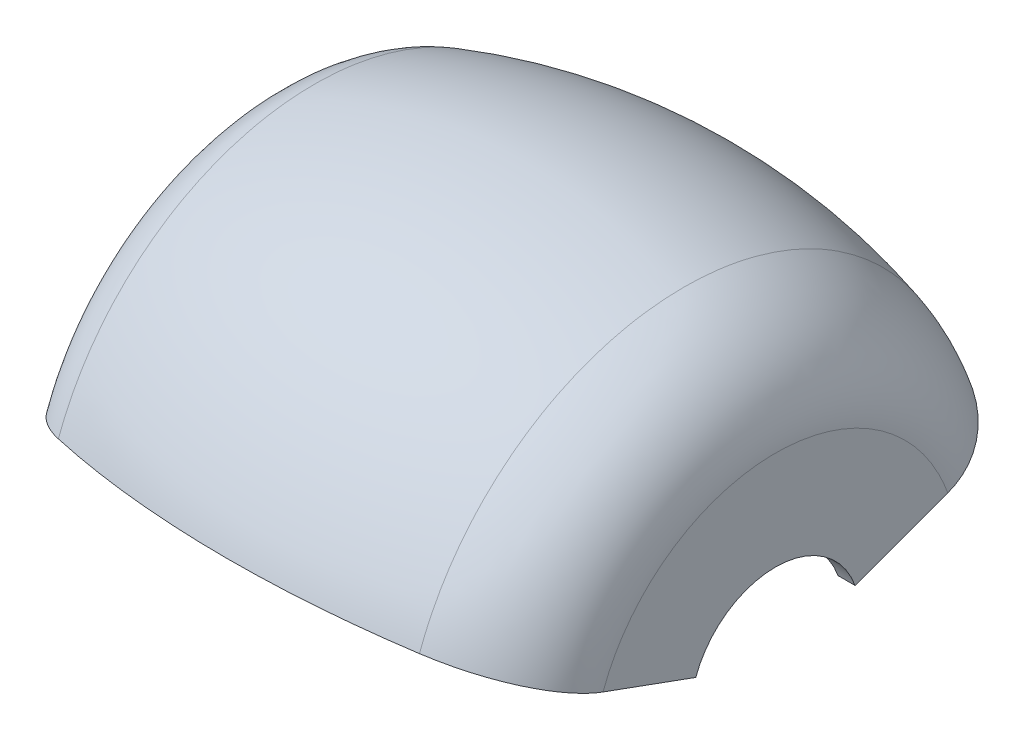
ISO-10303-21;
HEADER;
FILE_DESCRIPTION(('STEP AP214'),'2;1');
FILE_NAME('part.step','',(''),(''),'','','');
FILE_SCHEMA(('AUTOMOTIVE_DESIGN { 1 0 10303 214 1 1 1 1 }'));
ENDSEC;
DATA;
#1=APPLICATION_CONTEXT('core data for automotive mechanical design processes');
#2=APPLICATION_PROTOCOL_DEFINITION('international standard','automotive_design',2000,#1);
#3=PRODUCT_CONTEXT('',#1,'mechanical');
#4=PRODUCT('Part','Part','',(#3));
#5=PRODUCT_RELATED_PRODUCT_CATEGORY('part','',(#4));
#6=PRODUCT_DEFINITION_FORMATION('','',#4);
#7=PRODUCT_DEFINITION_CONTEXT('part definition',#1,'design');
#8=PRODUCT_DEFINITION('design','',#6,#7);
#9=PRODUCT_DEFINITION_SHAPE('','',#8);
#10=(LENGTH_UNIT() NAMED_UNIT(*) SI_UNIT(.MILLI.,.METRE.));
#11=(NAMED_UNIT(*) PLANE_ANGLE_UNIT() SI_UNIT($,.RADIAN.));
#12=(NAMED_UNIT(*) SI_UNIT($,.STERADIAN.) SOLID_ANGLE_UNIT());
#13=UNCERTAINTY_MEASURE_WITH_UNIT(LENGTH_MEASURE(1.E-05),#10,'distance_accuracy_value','');
#14=(GEOMETRIC_REPRESENTATION_CONTEXT(3) GLOBAL_UNCERTAINTY_ASSIGNED_CONTEXT((#13)) GLOBAL_UNIT_ASSIGNED_CONTEXT((#10,
#11,#12)) REPRESENTATION_CONTEXT('',''));
#15=CARTESIAN_POINT('',(0.,0.,0.));
#16=DIRECTION('',(0.,0.,1.));
#17=DIRECTION('',(1.,0.,0.));
#18=AXIS2_PLACEMENT_3D('',#15,#16,#17);
#19=CARTESIAN_POINT('',(0.232167243709482,0.,0.));
#20=DIRECTION('',(-1.,0.,0.));
#21=DIRECTION('',(0.,0.,1.));
#22=AXIS2_PLACEMENT_3D('',#19,#20,#21);
#23=DEGENERATE_TOROIDAL_SURFACE('',#22,49.611301747532,95.25,.F.);
#24=CARTESIAN_POINT('',(0.232167243709482,-16.9680645342638,46.6193741597389));
#25=DIRECTION('',(0.,0.93969262078591,0.342020143325666));
#26=DIRECTION('',(-1.,0.,0.));
#27=AXIS2_PLACEMENT_3D('',#24,#25,#26);
#28=CIRCLE('',#27,95.25);
#29=CARTESIAN_POINT('',(25.6830243821265,14.4246691292249,-39.63145271565));
#30=VERTEX_POINT('',#29);
#31=CARTESIAN_POINT('',(-29.6959608343053,13.9592704620694,-38.352780710956));
#32=VERTEX_POINT('',#31);
#33=EDGE_CURVE('E164',#30,#32,#28,.T.);
#34=ORIENTED_EDGE('',*,*,#33,.T.);
#35=CARTESIAN_POINT('',(-29.6957917777997,9.1813321579418,39.7687187359148));
#36=CARTESIAN_POINT('',(-29.6957917778131,13.6355401925726,38.7403837840581));
#37=CARTESIAN_POINT('',(-29.6957917777986,17.913607264452,36.9573256661375));
#38=CARTESIAN_POINT('',(-29.6957917778007,25.6451315839683,32.0790971141469));
#39=CARTESIAN_POINT('',(-29.695791777799,29.0965244800541,28.9850566464784));
#40=CARTESIAN_POINT('',(-29.6957917778004,34.7874653819627,21.8305633898133));
#41=CARTESIAN_POINT('',(-29.6957917777984,37.0258113219643,17.7716218046718));
#42=CARTESIAN_POINT('',(-29.6957917778009,40.0397966448433,9.14089329647315));
#43=CARTESIAN_POINT('',(-29.6957917777997,40.8147994003494,4.57092939424832));
#44=CARTESIAN_POINT('',(-29.6957917777997,40.8147994003494,-4.57092939424831));
#45=CARTESIAN_POINT('',(-29.6957917778009,40.0397966448433,-9.1408932964731));
#46=CARTESIAN_POINT('',(-29.6957917777984,37.0258113219643,-17.7716218046717));
#47=CARTESIAN_POINT('',(-29.6957917778008,34.787465381962,-21.8305633898139));
#48=CARTESIAN_POINT('',(-29.6957917777985,29.0965244800548,-28.9850566464778));
#49=CARTESIAN_POINT('',(-29.6957917778002,25.6451315839702,-32.0790971141458));
#50=CARTESIAN_POINT('',(-29.6957917777991,17.91360726445,-36.9573256661385));
#51=CARTESIAN_POINT('',(-29.6957917778018,13.635540192575,-38.7403837840614));
#52=CARTESIAN_POINT('',(-29.6957917777997,9.18133215794181,-39.7687187359148));
#53=(BOUNDED_CURVE() B_SPLINE_CURVE(3,(#35,#36,#37,#38,#39,#40,#41,#42,#43,#44,#45,#46,#47,#48,
#49,#50,#51,#52),.UNSPECIFIED.,.F.,.F.) B_SPLINE_CURVE_WITH_KNOTS((4,2,2,2,2,2,2,2,4),
(0.22689280275926,0.562868683768169,0.898844564777078,1.23482044578599,1.5707963267949,
1.90677220780381,2.24274808881272,2.57872396982162,2.91469985083053),
.UNSPECIFIED.) CURVE() GEOMETRIC_REPRESENTATION_ITEM() RATIONAL_B_SPLINE_CURVE((1.,1.,1.,1.,1.,
1.,1.,1.,1.,1.,1.,1.,1.,1.,1.,1.,1.,1.)) REPRESENTATION_ITEM(''));
#54=CARTESIAN_POINT('',(-29.6959608343167,13.959270566308,38.352780672989));
#55=VERTEX_POINT('',#54);
#56=EDGE_CURVE('E68',#32,#55,#53,.F.);
#57=ORIENTED_EDGE('',*,*,#56,.T.);
#58=CARTESIAN_POINT('',(0.232167243709482,-16.9680645342638,-46.6193741597389));
#59=DIRECTION('',(0.,-0.93969262078591,0.342020143325666));
#60=DIRECTION('',(-1.,0.,0.));
#61=AXIS2_PLACEMENT_3D('',#58,#59,#60);
#62=CIRCLE('',#61,95.25);
#63=CARTESIAN_POINT('',(25.6830243821252,14.4246690215097,39.631452754879));
#64=VERTEX_POINT('',#63);
#65=EDGE_CURVE('E214',#64,#55,#62,.T.);
#66=ORIENTED_EDGE('',*,*,#65,.F.);
#67=CARTESIAN_POINT('',(25.6828735879625,9.4874318579387,-41.094582201577));
#68=CARTESIAN_POINT('',(25.682873587968,14.0901403195042,-40.0319632247755));
#69=CARTESIAN_POINT('',(25.6828735879647,18.5108353913234,-38.1894590979904));
#70=CARTESIAN_POINT('',(25.6828735879603,26.500123751971,-33.1485935480237));
#71=CARTESIAN_POINT('',(25.6828735879591,30.0665838635013,-29.9513997646341));
#72=CARTESIAN_POINT('',(25.6828735879659,35.9472570696863,-22.5583803108204));
#73=CARTESIAN_POINT('',(25.6828735879666,38.2602280211729,-18.3641162283841));
#74=CARTESIAN_POINT('',(25.6828735879585,41.3746976734889,-9.4456447905546));
#75=CARTESIAN_POINT('',(25.6828735879625,42.1755385215316,-4.72332123622386));
#76=CARTESIAN_POINT('',(25.6828735879625,42.1755385215316,4.72332123622386));
#77=CARTESIAN_POINT('',(25.6828735879632,41.3746976734837,9.44564479056555));
#78=CARTESIAN_POINT('',(25.6828735879618,38.2602280211782,18.3641162283731));
#79=CARTESIAN_POINT('',(25.6828735879633,35.9472570696824,22.5583803108265));
#80=CARTESIAN_POINT('',(25.6828735879617,30.0665838635052,29.951399764628));
#81=CARTESIAN_POINT('',(25.6828735879635,26.5001237519635,33.1485935480274));
#82=CARTESIAN_POINT('',(25.6828735879615,18.510835391331,38.1894590979866));
#83=CARTESIAN_POINT('',(25.6828735879665,14.0901403194983,40.0319632247773));
#84=CARTESIAN_POINT('',(25.6828735879625,9.4874318579387,41.094582201577));
#85=(BOUNDED_CURVE() B_SPLINE_CURVE(3,(#67,#68,#69,#70,#71,#72,#73,#74,#75,#76,#77,#78,#79,#80,
#81,#82,#83,#84),.UNSPECIFIED.,.F.,.F.) B_SPLINE_CURVE_WITH_KNOTS((4,2,2,2,2,2,2,2,4),
(0.226892802759259,0.562868683768169,0.898844564777078,1.23482044578599,1.5707963267949,
1.90677220780381,2.24274808881272,2.57872396982162,2.91469985083053),
.UNSPECIFIED.) CURVE() GEOMETRIC_REPRESENTATION_ITEM() RATIONAL_B_SPLINE_CURVE((1.,1.,1.,1.,1.,
1.,1.,1.,1.,1.,1.,1.,1.,1.,1.,1.,1.,1.)) REPRESENTATION_ITEM(''));
#86=EDGE_CURVE('E251',#64,#30,#85,.F.);
#87=ORIENTED_EDGE('',*,*,#86,.T.);
#88=EDGE_LOOP('',(#34,#57,#66,#87));
#89=FACE_BOUND('',#88,.T.);
#90=ADVANCED_FACE('F40',(#89),#23,.F.);
#91=CARTESIAN_POINT('',(39.390760572882,4.34365582023596,11.9340962839811));
#92=DIRECTION('',(-1.,0.,0.));
#93=DIRECTION('',(0.,0.,1.));
#94=AXIS2_PLACEMENT_3D('',#91,#92,#93);
#95=PLANE('',#94);
#96=DIRECTION('',(0.,0.342020143325666,-0.93969262078591));
#97=VECTOR('',#96,1.);
#98=CARTESIAN_POINT('',(39.390760572882,4.34365582023596,-11.9340962839811));
#99=LINE('',#98,#97);
#100=CARTESIAN_POINT('',(39.390760572882,4.34365582023596,-11.9340962839811));
#101=VERTEX_POINT('',#100);
#102=CARTESIAN_POINT('',(39.390760572882,9.40175090013267,-25.8310983014519));
#103=VERTEX_POINT('',#102);
#104=EDGE_CURVE('E206',#101,#103,#99,.T.);
#105=ORIENTED_EDGE('',*,*,#104,.T.);
#106=CARTESIAN_POINT('',(39.390760572882,6.1838244189919,26.7850862816731));
#107=CARTESIAN_POINT('',(39.390760572882,9.18382920471687,26.0924806034017));
#108=CARTESIAN_POINT('',(39.390760572882,12.0651992681317,24.8915526619215));
#109=CARTESIAN_POINT('',(39.390760572882,17.2725469671309,21.6059609499019));
#110=CARTESIAN_POINT('',(39.390760572882,19.5971342165937,19.5220582367116));
#111=CARTESIAN_POINT('',(39.390760572882,23.4301051529847,14.7033533529152));
#112=CARTESIAN_POINT('',(39.390760572882,24.9376792219723,11.9695690115774));
#113=CARTESIAN_POINT('',(39.390760572882,26.9676630760274,6.15658797698049));
#114=CARTESIAN_POINT('',(39.390760572882,27.4896440784815,3.07861912861739));
#115=CARTESIAN_POINT('',(39.390760572882,27.4896440784815,-3.07861912861739));
#116=CARTESIAN_POINT('',(39.390760572882,26.9676630760381,-6.15658797697784));
#117=CARTESIAN_POINT('',(39.390760572882,24.9376792219616,-11.96956901158));
#118=CARTESIAN_POINT('',(39.390760572882,23.4301051529857,-14.7033533529112));
#119=CARTESIAN_POINT('',(39.390760572882,19.5971342165927,-19.5220582367157));
#120=CARTESIAN_POINT('',(39.390760572882,17.2725469671387,-21.6059609499079));
#121=CARTESIAN_POINT('',(39.390760572882,12.0651992681238,-24.8915526619155));
#122=CARTESIAN_POINT('',(39.390760572882,9.18382920472543,-26.0924806034177));
#123=CARTESIAN_POINT('',(39.390760572882,6.1838244189919,-26.7850862816731));
#124=(BOUNDED_CURVE() B_SPLINE_CURVE(3,(#106,#107,#108,#109,#110,#111,#112,#113,#114,#115,#116,
#117,#118,#119,#120,#121,#122,#123),.UNSPECIFIED.,.F.,.F.) B_SPLINE_CURVE_WITH_KNOTS((4,2,2,2,2,
2,2,2,4),(0.22689280275926,0.562868683768169,0.898844564777078,1.23482044578599,1.5707963267949,
1.90677220780381,2.24274808881272,2.57872396982162,2.91469985083053),
.UNSPECIFIED.) CURVE() GEOMETRIC_REPRESENTATION_ITEM() RATIONAL_B_SPLINE_CURVE((1.,1.,1.,1.,1.,
1.,1.,1.,1.,1.,1.,1.,1.,1.,1.,1.,1.,1.)) REPRESENTATION_ITEM(''));
#125=CARTESIAN_POINT('',(39.390760572882,9.40175090013067,25.8310983014464));
#126=VERTEX_POINT('',#125);
#127=EDGE_CURVE('E12',#103,#126,#124,.F.);
#128=ORIENTED_EDGE('',*,*,#127,.T.);
#129=DIRECTION('',(0.,0.342020143325666,0.93969262078591));
#130=VECTOR('',#129,1.);
#131=CARTESIAN_POINT('',(39.390760572882,4.34365582023596,11.9340962839811));
#132=LINE('',#131,#130);
#133=CARTESIAN_POINT('',(39.390760572882,4.34365582023596,11.9340962839811));
#134=VERTEX_POINT('',#133);
#135=EDGE_CURVE('E173',#134,#126,#132,.T.);
#136=ORIENTED_EDGE('',*,*,#135,.F.);
#137=CARTESIAN_POINT('',(39.390760572882,0.,0.));
#138=DIRECTION('',(-1.,0.,0.));
#139=DIRECTION('',(0.,0.,1.));
#140=AXIS2_PLACEMENT_3D('',#137,#138,#139);
#141=CIRCLE('',#140,12.7);
#142=EDGE_CURVE('E298',#134,#101,#141,.T.);
#143=ORIENTED_EDGE('',*,*,#142,.T.);
#144=EDGE_LOOP('',(#105,#128,#136,#143));
#145=FACE_BOUND('',#144,.T.);
#146=ADVANCED_FACE('F263',(#145),#95,.F.);
#147=CARTESIAN_POINT('',(-36.195,0.,0.));
#148=DIRECTION('',(-1.,0.,0.));
#149=DIRECTION('',(0.,0.,1.));
#150=AXIS2_PLACEMENT_3D('',#147,#148,#149);
#151=CYLINDRICAL_SURFACE('',#150,12.7);
#152=CARTESIAN_POINT('',(36.850760572882,0.,0.));
#153=DIRECTION('',(-1.,0.,0.));
#154=DIRECTION('',(0.,0.,1.));
#155=AXIS2_PLACEMENT_3D('',#152,#153,#154);
#156=CIRCLE('',#155,12.7);
#157=CARTESIAN_POINT('',(36.850760572882,4.34365582023596,11.9340962839811));
#158=VERTEX_POINT('',#157);
#159=CARTESIAN_POINT('',(36.850760572882,4.34365582023596,-11.9340962839811));
#160=VERTEX_POINT('',#159);
#161=EDGE_CURVE('E296',#158,#160,#156,.T.);
#162=ORIENTED_EDGE('',*,*,#161,.T.);
#163=DIRECTION('',(1.,0.,0.));
#164=VECTOR('',#163,1.);
#165=CARTESIAN_POINT('',(39.390760572882,4.34365582023596,-11.9340962839811));
#166=LINE('',#165,#164);
#167=EDGE_CURVE('E203',#160,#101,#166,.T.);
#168=ORIENTED_EDGE('',*,*,#167,.T.);
#169=ORIENTED_EDGE('',*,*,#142,.F.);
#170=DIRECTION('',(1.,0.,0.));
#171=VECTOR('',#170,1.);
#172=CARTESIAN_POINT('',(39.390760572882,4.34365582023596,11.9340962839811));
#173=LINE('',#172,#171);
#174=EDGE_CURVE('E277',#158,#134,#173,.T.);
#175=ORIENTED_EDGE('',*,*,#174,.F.);
#176=EDGE_LOOP('',(#162,#168,#169,#175));
#177=FACE_BOUND('',#176,.T.);
#178=ADVANCED_FACE('F329',(#177),#151,.F.);
#179=CARTESIAN_POINT('',(36.850760572882,4.34365582023596,11.9340962839811));
#180=DIRECTION('',(1.,0.,0.));
#181=DIRECTION('',(0.,0.,-1.));
#182=AXIS2_PLACEMENT_3D('',#179,#180,#181);
#183=PLANE('',#182);
#184=CARTESIAN_POINT('',(36.850760572882,0.,0.));
#185=DIRECTION('',(-1.,0.,0.));
#186=DIRECTION('',(0.,0.,1.));
#187=AXIS2_PLACEMENT_3D('',#184,#185,#186);
#188=CIRCLE('',#187,27.178);
#189=CARTESIAN_POINT('',(36.850760572882,9.29542345530495,25.5389660477195));
#190=VERTEX_POINT('',#189);
#191=CARTESIAN_POINT('',(36.850760572882,9.29542345530496,-25.5389660477194));
#192=VERTEX_POINT('',#191);
#193=EDGE_CURVE('E294',#190,#192,#188,.T.);
#194=ORIENTED_EDGE('',*,*,#193,.T.);
#195=DIRECTION('',(0.,-0.342020143325666,0.93969262078591));
#196=VECTOR('',#195,1.);
#197=CARTESIAN_POINT('',(36.850760572882,4.34365582023596,-11.9340962839811));
#198=LINE('',#197,#196);
#199=EDGE_CURVE('E200',#192,#160,#198,.T.);
#200=ORIENTED_EDGE('',*,*,#199,.T.);
#201=ORIENTED_EDGE('',*,*,#161,.F.);
#202=DIRECTION('',(0.,-0.342020143325666,-0.93969262078591));
#203=VECTOR('',#202,1.);
#204=CARTESIAN_POINT('',(36.850760572882,4.34365582023596,11.9340962839811));
#205=LINE('',#204,#203);
#206=EDGE_CURVE('E320',#190,#158,#205,.T.);
#207=ORIENTED_EDGE('',*,*,#206,.F.);
#208=EDGE_LOOP('',(#194,#200,#201,#207));
#209=FACE_BOUND('',#208,.T.);
#210=ADVANCED_FACE('F334',(#209),#183,.F.);
#211=CARTESIAN_POINT('',(-36.195,0.,0.));
#212=DIRECTION('',(-1.,0.,0.));
#213=DIRECTION('',(0.,0.,1.));
#214=AXIS2_PLACEMENT_3D('',#211,#212,#213);
#215=CYLINDRICAL_SURFACE('',#214,27.178);
#216=CARTESIAN_POINT('',(26.690760572882,0.,0.));
#217=DIRECTION('',(-1.,0.,0.));
#218=DIRECTION('',(0.,0.,1.));
#219=AXIS2_PLACEMENT_3D('',#216,#217,#218);
#220=CIRCLE('',#219,27.178);
#221=CARTESIAN_POINT('',(26.690760572882,9.29542345530495,25.5389660477195));
#222=VERTEX_POINT('',#221);
#223=CARTESIAN_POINT('',(26.690760572882,9.29542345530496,-25.5389660477194));
#224=VERTEX_POINT('',#223);
#225=EDGE_CURVE('E292',#222,#224,#220,.T.);
#226=ORIENTED_EDGE('',*,*,#225,.T.);
#227=DIRECTION('',(1.,0.,0.));
#228=VECTOR('',#227,1.);
#229=CARTESIAN_POINT('',(36.850760572882,9.29542345530496,-25.5389660477194));
#230=LINE('',#229,#228);
#231=EDGE_CURVE('E197',#224,#192,#230,.T.);
#232=ORIENTED_EDGE('',*,*,#231,.T.);
#233=ORIENTED_EDGE('',*,*,#193,.F.);
#234=DIRECTION('',(1.,0.,0.));
#235=VECTOR('',#234,1.);
#236=CARTESIAN_POINT('',(36.850760572882,9.29542345530495,25.5389660477195));
#237=LINE('',#236,#235);
#238=EDGE_CURVE('E318',#222,#190,#237,.T.);
#239=ORIENTED_EDGE('',*,*,#238,.F.);
#240=EDGE_LOOP('',(#226,#232,#233,#239));
#241=FACE_BOUND('',#240,.T.);
#242=ADVANCED_FACE('F337',(#241),#215,.F.);
#243=CARTESIAN_POINT('',(26.690760572882,9.29542345530495,25.5389660477195));
#244=DIRECTION('',(1.,0.,0.));
#245=DIRECTION('',(0.,0.,-1.));
#246=AXIS2_PLACEMENT_3D('',#243,#244,#245);
#247=PLANE('',#246);
#248=CARTESIAN_POINT('',(26.690760572882,0.,0.));
#249=DIRECTION('',(-1.,0.,0.));
#250=DIRECTION('',(0.,0.,1.));
#251=AXIS2_PLACEMENT_3D('',#248,#249,#250);
#252=CIRCLE('',#251,39.243);
#253=CARTESIAN_POINT('',(26.690760572882,13.4218964845291,36.8763575175014));
#254=VERTEX_POINT('',#253);
#255=CARTESIAN_POINT('',(26.690760572882,13.4218964845291,-36.8763575175014));
#256=VERTEX_POINT('',#255);
#257=EDGE_CURVE('E290',#254,#256,#252,.T.);
#258=ORIENTED_EDGE('',*,*,#257,.T.);
#259=DIRECTION('',(0.,-0.342020143325666,0.93969262078591));
#260=VECTOR('',#259,1.);
#261=CARTESIAN_POINT('',(26.690760572882,9.29542345530496,-25.5389660477194));
#262=LINE('',#261,#260);
#263=EDGE_CURVE('E194',#256,#224,#262,.T.);
#264=ORIENTED_EDGE('',*,*,#263,.T.);
#265=ORIENTED_EDGE('',*,*,#225,.F.);
#266=DIRECTION('',(0.,-0.342020143325666,-0.93969262078591));
#267=VECTOR('',#266,1.);
#268=CARTESIAN_POINT('',(26.690760572882,9.29542345530495,25.5389660477195));
#269=LINE('',#268,#267);
#270=EDGE_CURVE('E315',#254,#222,#269,.T.);
#271=ORIENTED_EDGE('',*,*,#270,.F.);
#272=EDGE_LOOP('',(#258,#264,#265,#271));
#273=FACE_BOUND('',#272,.T.);
#274=ADVANCED_FACE('F340',(#273),#247,.F.);
#275=CARTESIAN_POINT('',(0.232167243709482,0.,0.));
#276=DIRECTION('',(-1.,0.,0.));
#277=DIRECTION('',(0.,0.,1.));
#278=AXIS2_PLACEMENT_3D('',#275,#276,#277);
#279=DEGENERATE_TOROIDAL_SURFACE('',#278,49.611301747532,92.71,.F.);
#280=CARTESIAN_POINT('',(-26.649239427118,0.,0.));
#281=DIRECTION('',(-1.,0.,0.));
#282=DIRECTION('',(0.,0.,1.));
#283=AXIS2_PLACEMENT_3D('',#280,#281,#282);
#284=CIRCLE('',#283,39.116);
#285=CARTESIAN_POINT('',(-26.649239427118,13.3784599263268,36.7570165546616));
#286=VERTEX_POINT('',#285);
#287=CARTESIAN_POINT('',(-26.649239427118,13.3784599263268,-36.7570165546616));
#288=VERTEX_POINT('',#287);
#289=EDGE_CURVE('E288',#286,#288,#284,.T.);
#290=ORIENTED_EDGE('',*,*,#289,.T.);
#291=CARTESIAN_POINT('',(0.232167243709482,-16.9680645342638,46.6193741597389));
#292=DIRECTION('',(0.,-0.93969262078591,-0.342020143325666));
#293=DIRECTION('',(-1.,0.,0.));
#294=AXIS2_PLACEMENT_3D('',#291,#292,#293);
#295=CIRCLE('',#294,92.71);
#296=EDGE_CURVE('E191',#288,#256,#295,.T.);
#297=ORIENTED_EDGE('',*,*,#296,.T.);
#298=ORIENTED_EDGE('',*,*,#257,.F.);
#299=CARTESIAN_POINT('',(0.232167243709482,-16.9680645342638,-46.6193741597389));
#300=DIRECTION('',(0.,0.93969262078591,-0.342020143325666));
#301=DIRECTION('',(-1.,0.,0.));
#302=AXIS2_PLACEMENT_3D('',#299,#300,#301);
#303=CIRCLE('',#302,92.71);
#304=EDGE_CURVE('E312',#286,#254,#303,.T.);
#305=ORIENTED_EDGE('',*,*,#304,.F.);
#306=EDGE_LOOP('',(#290,#297,#298,#305));
#307=FACE_BOUND('',#306,.T.);
#308=ADVANCED_FACE('F344',(#307),#279,.T.);
#309=CARTESIAN_POINT('',(-26.649239427118,9.2519868971026,25.4196250848796));
#310=DIRECTION('',(-1.,0.,0.));
#311=DIRECTION('',(0.,0.,1.));
#312=AXIS2_PLACEMENT_3D('',#309,#310,#311);
#313=PLANE('',#312);
#314=CARTESIAN_POINT('',(-26.649239427118,0.,0.));
#315=DIRECTION('',(-1.,0.,0.));
#316=DIRECTION('',(0.,0.,1.));
#317=AXIS2_PLACEMENT_3D('',#314,#315,#316);
#318=CIRCLE('',#317,27.051);
#319=CARTESIAN_POINT('',(-26.649239427118,9.2519868971026,25.4196250848796));
#320=VERTEX_POINT('',#319);
#321=CARTESIAN_POINT('',(-26.649239427118,9.2519868971026,-25.4196250848796));
#322=VERTEX_POINT('',#321);
#323=EDGE_CURVE('E286',#320,#322,#318,.T.);
#324=ORIENTED_EDGE('',*,*,#323,.T.);
#325=DIRECTION('',(0.,0.342020143325666,-0.93969262078591));
#326=VECTOR('',#325,1.);
#327=CARTESIAN_POINT('',(-26.649239427118,9.2519868971026,-25.4196250848796));
#328=LINE('',#327,#326);
#329=EDGE_CURVE('E188',#322,#288,#328,.T.);
#330=ORIENTED_EDGE('',*,*,#329,.T.);
#331=ORIENTED_EDGE('',*,*,#289,.F.);
#332=DIRECTION('',(0.,0.342020143325666,0.93969262078591));
#333=VECTOR('',#332,1.);
#334=CARTESIAN_POINT('',(-26.649239427118,9.2519868971026,25.4196250848796));
#335=LINE('',#334,#333);
#336=EDGE_CURVE('E309',#320,#286,#335,.T.);
#337=ORIENTED_EDGE('',*,*,#336,.F.);
#338=EDGE_LOOP('',(#324,#330,#331,#337));
#339=FACE_BOUND('',#338,.T.);
#340=ADVANCED_FACE('F348',(#339),#313,.F.);
#341=CARTESIAN_POINT('',(-36.195,0.,0.));
#342=DIRECTION('',(-1.,0.,0.));
#343=DIRECTION('',(0.,0.,1.));
#344=AXIS2_PLACEMENT_3D('',#341,#342,#343);
#345=CYLINDRICAL_SURFACE('',#344,27.051);
#346=CARTESIAN_POINT('',(-36.809239427118,0.,0.));
#347=DIRECTION('',(-1.,0.,0.));
#348=DIRECTION('',(0.,0.,1.));
#349=AXIS2_PLACEMENT_3D('',#346,#347,#348);
#350=CIRCLE('',#349,27.051);
#351=CARTESIAN_POINT('',(-36.809239427118,9.2519868971026,25.4196250848796));
#352=VERTEX_POINT('',#351);
#353=CARTESIAN_POINT('',(-36.809239427118,9.2519868971026,-25.4196250848796));
#354=VERTEX_POINT('',#353);
#355=EDGE_CURVE('E284',#352,#354,#350,.T.);
#356=ORIENTED_EDGE('',*,*,#355,.T.);
#357=DIRECTION('',(1.,0.,0.));
#358=VECTOR('',#357,1.);
#359=CARTESIAN_POINT('',(-36.809239427118,9.2519868971026,-25.4196250848796));
#360=LINE('',#359,#358);
#361=EDGE_CURVE('E180',#354,#322,#360,.T.);
#362=ORIENTED_EDGE('',*,*,#361,.T.);
#363=ORIENTED_EDGE('',*,*,#323,.F.);
#364=DIRECTION('',(1.,0.,0.));
#365=VECTOR('',#364,1.);
#366=CARTESIAN_POINT('',(-36.809239427118,9.2519868971026,25.4196250848796));
#367=LINE('',#366,#365);
#368=EDGE_CURVE('E306',#352,#320,#367,.T.);
#369=ORIENTED_EDGE('',*,*,#368,.F.);
#370=EDGE_LOOP('',(#356,#362,#363,#369));
#371=FACE_BOUND('',#370,.T.);
#372=ADVANCED_FACE('F351',(#371),#345,.F.);
#373=CARTESIAN_POINT('',(-36.809239427118,3.04055907416517,8.35386739878673));
#374=DIRECTION('',(-1.,0.,0.));
#375=DIRECTION('',(0.,0.,1.));
#376=AXIS2_PLACEMENT_3D('',#373,#374,#375);
#377=PLANE('',#376);
#378=CARTESIAN_POINT('',(-36.809239427118,0.,0.));
#379=DIRECTION('',(-1.,0.,0.));
#380=DIRECTION('',(0.,0.,1.));
#381=AXIS2_PLACEMENT_3D('',#378,#379,#380);
#382=CIRCLE('',#381,8.89);
#383=CARTESIAN_POINT('',(-36.809239427118,3.04055907416517,8.35386739878673));
#384=VERTEX_POINT('',#383);
#385=CARTESIAN_POINT('',(-36.809239427118,3.04055907416517,-8.35386739878673));
#386=VERTEX_POINT('',#385);
#387=EDGE_CURVE('E172',#384,#386,#382,.T.);
#388=ORIENTED_EDGE('',*,*,#387,.T.);
#389=DIRECTION('',(0.,0.342020143325666,-0.93969262078591));
#390=VECTOR('',#389,1.);
#391=CARTESIAN_POINT('',(-36.809239427118,3.04055907416517,-8.35386739878673));
#392=LINE('',#391,#390);
#393=EDGE_CURVE('E178',#386,#354,#392,.T.);
#394=ORIENTED_EDGE('',*,*,#393,.T.);
#395=ORIENTED_EDGE('',*,*,#355,.F.);
#396=DIRECTION('',(0.,0.342020143325666,0.93969262078591));
#397=VECTOR('',#396,1.);
#398=CARTESIAN_POINT('',(-36.809239427118,3.04055907416517,8.35386739878673));
#399=LINE('',#398,#397);
#400=EDGE_CURVE('E303',#384,#352,#399,.T.);
#401=ORIENTED_EDGE('',*,*,#400,.F.);
#402=EDGE_LOOP('',(#388,#394,#395,#401));
#403=FACE_BOUND('',#402,.T.);
#404=ADVANCED_FACE('F354',(#403),#377,.F.);
#405=CARTESIAN_POINT('',(-36.195,0.,0.));
#406=DIRECTION('',(-1.,0.,0.));
#407=DIRECTION('',(0.,0.,1.));
#408=AXIS2_PLACEMENT_3D('',#405,#406,#407);
#409=CYLINDRICAL_SURFACE('',#408,8.89);
#410=CARTESIAN_POINT('',(-39.349239427118,0.,0.));
#411=DIRECTION('',(-1.,0.,0.));
#412=DIRECTION('',(0.,0.,1.));
#413=AXIS2_PLACEMENT_3D('',#410,#411,#412);
#414=CIRCLE('',#413,8.89);
#415=CARTESIAN_POINT('',(-39.349239427118,3.04055907416517,8.35386739878673));
#416=VERTEX_POINT('',#415);
#417=CARTESIAN_POINT('',(-39.349239427118,3.04055907416517,-8.35386739878673));
#418=VERTEX_POINT('',#417);
#419=EDGE_CURVE('E156',#416,#418,#414,.T.);
#420=ORIENTED_EDGE('',*,*,#419,.T.);
#421=DIRECTION('',(1.,0.,0.));
#422=VECTOR('',#421,1.);
#423=CARTESIAN_POINT('',(-39.349239427118,3.04055907416517,-8.35386739878673));
#424=LINE('',#423,#422);
#425=EDGE_CURVE('E163',#418,#386,#424,.T.);
#426=ORIENTED_EDGE('',*,*,#425,.T.);
#427=ORIENTED_EDGE('',*,*,#387,.F.);
#428=DIRECTION('',(1.,0.,0.));
#429=VECTOR('',#428,1.);
#430=CARTESIAN_POINT('',(-39.349239427118,3.04055907416517,8.35386739878673));
#431=LINE('',#430,#429);
#432=EDGE_CURVE('E171',#416,#384,#431,.T.);
#433=ORIENTED_EDGE('',*,*,#432,.F.);
#434=EDGE_LOOP('',(#420,#426,#427,#433));
#435=FACE_BOUND('',#434,.T.);
#436=ADVANCED_FACE('F168',(#435),#409,.F.);
#437=CARTESIAN_POINT('',(-39.349239427118,12.6633470594311,34.7922601005044));
#438=DIRECTION('',(1.,0.,0.));
#439=DIRECTION('',(0.,0.,-1.));
#440=AXIS2_PLACEMENT_3D('',#437,#438,#439);
#441=PLANE('',#440);
#442=DIRECTION('',(0.,-0.342020143325666,-0.93969262078591));
#443=VECTOR('',#442,1.);
#444=CARTESIAN_POINT('',(-39.349239427118,12.6633470594311,34.7922601005044));
#445=LINE('',#444,#443);
#446=CARTESIAN_POINT('',(-39.349239427118,8.1861138867671,22.4911630569767));
#447=VERTEX_POINT('',#446);
#448=EDGE_CURVE('E247',#447,#416,#445,.T.);
#449=ORIENTED_EDGE('',*,*,#448,.F.);
#450=CARTESIAN_POINT('',(-39.349239427118,5.38426208983663,-23.3218013429505));
#451=CARTESIAN_POINT('',(-39.349239427118,7.99636924907702,-22.7187488880656));
#452=CARTESIAN_POINT('',(-39.349239427118,10.5051810376729,-21.6730997313746));
#453=CARTESIAN_POINT('',(-39.349239427118,15.0392238730866,-18.8123317506234));
#454=CARTESIAN_POINT('',(-39.349239427118,17.0632443101883,-16.9978755793525));
#455=CARTESIAN_POINT('',(-39.349239427118,20.4006159275696,-12.802224430784));
#456=CARTESIAN_POINT('',(-39.349239427118,21.713262173382,-10.4219156775683));
#457=CARTESIAN_POINT('',(-39.349239427118,23.4807711398526,-5.36054729278711));
#458=CARTESIAN_POINT('',(-39.349239427118,23.9352605194115,-2.68055674594918));
#459=CARTESIAN_POINT('',(-39.349239427118,23.9352605194115,2.68055674594919));
#460=CARTESIAN_POINT('',(-39.349239427118,23.4807711398526,5.36054729278714));
#461=CARTESIAN_POINT('',(-39.349239427118,21.713262173382,10.4219156775683));
#462=CARTESIAN_POINT('',(-39.349239427118,20.4006159275699,12.8022244307849));
#463=CARTESIAN_POINT('',(-39.349239427118,17.0632443101881,16.9978755793516));
#464=CARTESIAN_POINT('',(-39.349239427118,15.0392238730829,18.8123317506226));
#465=CARTESIAN_POINT('',(-39.349239427118,10.5051810376766,21.6730997313755));
#466=CARTESIAN_POINT('',(-39.349239427118,7.99636924907492,22.718748888068));
#467=CARTESIAN_POINT('',(-39.349239427118,5.38426208983662,23.3218013429505));
#468=(BOUNDED_CURVE() B_SPLINE_CURVE(3,(#450,#451,#452,#453,#454,#455,#456,#457,#458,#459,#460,
#461,#462,#463,#464,#465,#466,#467),.UNSPECIFIED.,.F.,.F.) B_SPLINE_CURVE_WITH_KNOTS((4,2,2,2,2,
2,2,2,4),(0.22689280275926,0.562868683768169,0.898844564777078,1.23482044578599,1.5707963267949,
1.90677220780381,2.24274808881272,2.57872396982162,2.91469985083053),
.UNSPECIFIED.) CURVE() GEOMETRIC_REPRESENTATION_ITEM() RATIONAL_B_SPLINE_CURVE((1.,1.,1.,1.,1.,
1.,1.,1.,1.,1.,1.,1.,1.,1.,1.,1.,1.,1.)) REPRESENTATION_ITEM(''));
#469=CARTESIAN_POINT('',(-39.349239427118,8.18611388676669,-22.4911630569756));
#470=VERTEX_POINT('',#469);
#471=EDGE_CURVE('E159',#447,#470,#468,.F.);
#472=ORIENTED_EDGE('',*,*,#471,.T.);
#473=DIRECTION('',(0.,-0.342020143325666,0.93969262078591));
#474=VECTOR('',#473,1.);
#475=CARTESIAN_POINT('',(-39.349239427118,12.6633470594311,-34.7922601005044));
#476=LINE('',#475,#474);
#477=EDGE_CURVE('E152',#470,#418,#476,.T.);
#478=ORIENTED_EDGE('',*,*,#477,.T.);
#479=ORIENTED_EDGE('',*,*,#419,.F.);
#480=EDGE_LOOP('',(#449,#472,#478,#479));
#481=FACE_BOUND('',#480,.T.);
#482=ADVANCED_FACE('F155',(#481),#441,.F.);
#483=CARTESIAN_POINT('',(0.232167243709482,-16.9680645342638,-46.6193741597389));
#484=DIRECTION('',(0.,0.93969262078591,-0.342020143325666));
#485=DIRECTION('',(-1.,0.,0.));
#486=AXIS2_PLACEMENT_3D('',#483,#484,#485);
#487=PLANE('',#486);
#488=ORIENTED_EDGE('',*,*,#65,.T.);
#489=CARTESIAN_POINT('',(-39.349239427118,8.18611388676675,22.4911630569769));
#490=CARTESIAN_POINT('',(-39.349239427118,12.8663847428718,35.3501015510513));
#491=CARTESIAN_POINT('',(-29.6957917778053,13.9590958655256,38.3523006865355));
#492=(BOUNDED_CURVE() B_SPLINE_CURVE(2,(#489,#490,#491),.UNSPECIFIED.,.F.,
.F.) B_SPLINE_CURVE_WITH_KNOTS((3,3),(0.,1.),
.UNSPECIFIED.) CURVE() GEOMETRIC_REPRESENTATION_ITEM() RATIONAL_B_SPLINE_CURVE((1.,
0.810618373277177,1.)) REPRESENTATION_ITEM(''));
#493=EDGE_CURVE('E54',#55,#447,#492,.F.);
#494=ORIENTED_EDGE('',*,*,#493,.T.);
#495=ORIENTED_EDGE('',*,*,#448,.T.);
#496=ORIENTED_EDGE('',*,*,#432,.T.);
#497=ORIENTED_EDGE('',*,*,#400,.T.);
#498=ORIENTED_EDGE('',*,*,#368,.T.);
#499=ORIENTED_EDGE('',*,*,#336,.T.);
#500=ORIENTED_EDGE('',*,*,#304,.T.);
#501=ORIENTED_EDGE('',*,*,#270,.T.);
#502=ORIENTED_EDGE('',*,*,#238,.T.);
#503=ORIENTED_EDGE('',*,*,#206,.T.);
#504=ORIENTED_EDGE('',*,*,#174,.T.);
#505=ORIENTED_EDGE('',*,*,#135,.T.);
#506=CARTESIAN_POINT('',(25.682873587964,14.4244831299506,39.6309416868462));
#507=CARTESIAN_POINT('',(39.3907605728942,13.1245244175395,36.0593344782711));
#508=CARTESIAN_POINT('',(39.390760572882,9.40175090013118,25.8310983014462));
#509=(BOUNDED_CURVE() B_SPLINE_CURVE(2,(#506,#507,#508),.UNSPECIFIED.,.F.,
.F.) B_SPLINE_CURVE_WITH_KNOTS((3,3),(0.,1.),
.UNSPECIFIED.) CURVE() GEOMETRIC_REPRESENTATION_ITEM() RATIONAL_B_SPLINE_CURVE((1.,
0.795989640867758,1.)) REPRESENTATION_ITEM(''));
#510=EDGE_CURVE('E429',#126,#64,#509,.F.);
#511=ORIENTED_EDGE('',*,*,#510,.T.);
#512=EDGE_LOOP('',(#488,#494,#495,#496,#497,#498,#499,#500,#501,#502,#503,#504,#505,#511));
#513=FACE_BOUND('',#512,.T.);
#514=ADVANCED_FACE('F234',(#513),#487,.F.);
#515=CARTESIAN_POINT('',(0.232167243709482,-16.9680645342638,46.6193741597389));
#516=DIRECTION('',(0.,-0.93969262078591,-0.342020143325666));
#517=DIRECTION('',(-1.,0.,0.));
#518=AXIS2_PLACEMENT_3D('',#515,#516,#517);
#519=PLANE('',#518);
#520=ORIENTED_EDGE('',*,*,#477,.F.);
#521=CARTESIAN_POINT('',(-29.6957917778005,13.9590958655257,-38.3523006865374));
#522=CARTESIAN_POINT('',(-39.3492394271156,12.8663847428713,-35.3501015510479));
#523=CARTESIAN_POINT('',(-39.349239427118,8.18611388676649,-22.4911630569757));
#524=(BOUNDED_CURVE() B_SPLINE_CURVE(2,(#521,#522,#523),.UNSPECIFIED.,.F.,
.F.) B_SPLINE_CURVE_WITH_KNOTS((3,3),(0.,1.),
.UNSPECIFIED.) CURVE() GEOMETRIC_REPRESENTATION_ITEM() RATIONAL_B_SPLINE_CURVE((1.,
0.810618373277177,1.)) REPRESENTATION_ITEM(''));
#525=EDGE_CURVE('E360',#470,#32,#524,.F.);
#526=ORIENTED_EDGE('',*,*,#525,.T.);
#527=ORIENTED_EDGE('',*,*,#33,.F.);
#528=CARTESIAN_POINT('',(39.390760572882,9.40175090013278,-25.8310983014518));
#529=CARTESIAN_POINT('',(39.3907605728935,13.124524417538,-36.0593344782635));
#530=CARTESIAN_POINT('',(25.6828735879655,14.424483129951,-39.6309416868465));
#531=(BOUNDED_CURVE() B_SPLINE_CURVE(2,(#528,#529,#530),.UNSPECIFIED.,.F.,
.F.) B_SPLINE_CURVE_WITH_KNOTS((3,3),(0.,1.),
.UNSPECIFIED.) CURVE() GEOMETRIC_REPRESENTATION_ITEM() RATIONAL_B_SPLINE_CURVE((1.,
0.795989640867758,1.)) REPRESENTATION_ITEM(''));
#532=EDGE_CURVE('E219',#30,#103,#531,.F.);
#533=ORIENTED_EDGE('',*,*,#532,.T.);
#534=ORIENTED_EDGE('',*,*,#104,.F.);
#535=ORIENTED_EDGE('',*,*,#167,.F.);
#536=ORIENTED_EDGE('',*,*,#199,.F.);
#537=ORIENTED_EDGE('',*,*,#231,.F.);
#538=ORIENTED_EDGE('',*,*,#263,.F.);
#539=ORIENTED_EDGE('',*,*,#296,.F.);
#540=ORIENTED_EDGE('',*,*,#329,.F.);
#541=ORIENTED_EDGE('',*,*,#361,.F.);
#542=ORIENTED_EDGE('',*,*,#393,.F.);
#543=ORIENTED_EDGE('',*,*,#425,.F.);
#544=EDGE_LOOP('',(#520,#526,#527,#533,#534,#535,#536,#537,#538,#539,#540,#541,#542,#543));
#545=FACE_BOUND('',#544,.T.);
#546=ADVANCED_FACE('F175',(#545),#519,.T.);
#547=CARTESIAN_POINT('',(-29.6957917777997,9.18133215794181,-39.7687187359148));
#548=CARTESIAN_POINT('',(-29.6957917778018,13.635540192575,-38.7403837840614));
#549=CARTESIAN_POINT('',(-29.6957917777991,17.91360726445,-36.9573256661385));
#550=CARTESIAN_POINT('',(-29.6957917778002,25.6451315839702,-32.0790971141458));
#551=CARTESIAN_POINT('',(-29.6957917777985,29.0965244800548,-28.9850566464778));
#552=CARTESIAN_POINT('',(-29.6957917778008,34.787465381962,-21.8305633898139));
#553=CARTESIAN_POINT('',(-29.6957917777984,37.0258113219643,-17.7716218046717));
#554=CARTESIAN_POINT('',(-29.6957917778009,40.0397966448433,-9.1408932964731));
#555=CARTESIAN_POINT('',(-29.6957917777997,40.8147994003494,-4.57092939424831));
#556=CARTESIAN_POINT('',(-29.6957917777997,40.8147994003494,4.57092939424832));
#557=CARTESIAN_POINT('',(-29.6957917778009,40.0397966448433,9.14089329647315));
#558=CARTESIAN_POINT('',(-29.6957917777984,37.0258113219643,17.7716218046718));
#559=CARTESIAN_POINT('',(-29.6957917778004,34.7874653819627,21.8305633898133));
#560=CARTESIAN_POINT('',(-29.695791777799,29.0965244800541,28.9850566464784));
#561=CARTESIAN_POINT('',(-29.6957917778007,25.6451315839683,32.0790971141469));
#562=CARTESIAN_POINT('',(-29.6957917777986,17.913607264452,36.9573256661375));
#563=CARTESIAN_POINT('',(-29.6957917778131,13.6355401925726,38.7403837840581));
#564=CARTESIAN_POINT('',(-29.6957917777997,9.1813321579418,39.7687187359148));
#565=CARTESIAN_POINT('',(-39.349239427118,8.46262201608313,-36.6556430958505));
#566=CARTESIAN_POINT('',(-39.349239427118,12.5681568480259,-35.7078056955516));
#567=CARTESIAN_POINT('',(-39.3492394271087,16.5113389446853,-34.0643244855541));
#568=CARTESIAN_POINT('',(-39.3492394271273,23.6376433631382,-29.5679612527089));
#569=CARTESIAN_POINT('',(-39.3492394271273,26.8188629297603,-26.7161207430815));
#570=CARTESIAN_POINT('',(-39.3492394271087,32.064319791594,-20.1216776811984));
#571=CARTESIAN_POINT('',(-39.3492394271273,34.1274491181094,-16.3804680365062));
#572=CARTESIAN_POINT('',(-39.3492394271087,36.9055011600926,-8.4253486886969));
#573=CARTESIAN_POINT('',(-39.349239427118,37.6198370830798,-4.21311930124078));
#574=CARTESIAN_POINT('',(-39.349239427118,37.6198370830798,4.21311930124079));
#575=CARTESIAN_POINT('',(-39.349239427118,36.9055011600925,8.42534868869462));
#576=CARTESIAN_POINT('',(-39.349239427118,34.1274491181094,16.3804680365085));
#577=CARTESIAN_POINT('',(-39.349239427118,32.0643197915963,20.1216776811932));
#578=CARTESIAN_POINT('',(-39.349239427118,26.818862929758,26.7161207430867));
#579=CARTESIAN_POINT('',(-39.349239427118,23.6376433631287,29.5679612527056));
#580=CARTESIAN_POINT('',(-39.349239427118,16.5113389446947,34.0643244855575));
#581=CARTESIAN_POINT('',(-39.349239427118,12.5681568480207,35.7078056955576));
#582=CARTESIAN_POINT('',(-39.349239427118,8.46262201608312,36.6556430958505));
#583=CARTESIAN_POINT('',(-39.349239427118,5.38426208983663,-23.3218013429505));
#584=CARTESIAN_POINT('',(-39.349239427118,7.99636924907702,-22.7187488880656));
#585=CARTESIAN_POINT('',(-39.349239427118,10.5051810376729,-21.6730997313746));
#586=CARTESIAN_POINT('',(-39.349239427118,15.0392238730866,-18.8123317506234));
#587=CARTESIAN_POINT('',(-39.349239427118,17.0632443101883,-16.9978755793525));
#588=CARTESIAN_POINT('',(-39.349239427118,20.4006159275696,-12.802224430784));
#589=CARTESIAN_POINT('',(-39.349239427118,21.713262173382,-10.4219156775683));
#590=CARTESIAN_POINT('',(-39.349239427118,23.4807711398526,-5.36054729278711));
#591=CARTESIAN_POINT('',(-39.349239427118,23.9352605194115,-2.68055674594918));
#592=CARTESIAN_POINT('',(-39.349239427118,23.9352605194115,2.68055674594919));
#593=CARTESIAN_POINT('',(-39.349239427118,23.4807711398526,5.36054729278714));
#594=CARTESIAN_POINT('',(-39.349239427118,21.713262173382,10.4219156775683));
#595=CARTESIAN_POINT('',(-39.349239427118,20.4006159275699,12.8022244307849));
#596=CARTESIAN_POINT('',(-39.349239427118,17.0632443101881,16.9978755793516));
#597=CARTESIAN_POINT('',(-39.349239427118,15.0392238730829,18.8123317506226));
#598=CARTESIAN_POINT('',(-39.349239427118,10.5051810376766,21.6730997313755));
#599=CARTESIAN_POINT('',(-39.349239427118,7.99636924907492,22.718748888068));
#600=CARTESIAN_POINT('',(-39.349239427118,5.38426208983662,23.3218013429505));
#601=(BOUNDED_SURFACE() B_SPLINE_SURFACE(2,3,((#547,#548,#549,#550,#551,#552,#553,#554,#555,
#556,#557,#558,#559,#560,#561,#562,#563,#564),(#565,#566,#567,#568,#569,#570,#571,#572,#573,
#574,#575,#576,#577,#578,#579,#580,#581,#582),(#583,#584,#585,#586,#587,#588,#589,#590,#591,
#592,#593,#594,#595,#596,#597,#598,#599,#600)),.UNSPECIFIED.,.F.,.F.,
.F.) B_SPLINE_SURFACE_WITH_KNOTS((3,3),(4,2,2,2,2,2,2,2,4),(0.,1.),(0.22689280275926,
0.562868683768169,0.898844564777078,1.23482044578599,1.5707963267949,1.90677220780381,
2.24274808881272,2.57872396982162,2.91469985083053),
.UNSPECIFIED.) GEOMETRIC_REPRESENTATION_ITEM() RATIONAL_B_SPLINE_SURFACE(((1.,1.,1.,1.,1.,1.,1.,
1.,1.,1.,1.,1.,1.,1.,1.,1.,1.,1.),(0.810618373277177,0.810618373277177,0.810618373277177,
0.810618373277177,0.810618373277177,0.810618373277177,0.810618373277177,0.810618373277177,
0.810618373277177,0.810618373277177,0.810618373277177,0.810618373277177,0.810618373277177,
0.810618373277177,0.810618373277177,0.810618373277177,0.810618373277177,0.810618373277177),(1.,
1.,1.,1.,1.,1.,1.,1.,1.,1.,1.,1.,1.,1.,1.,1.,1.,1.))) REPRESENTATION_ITEM('') SURFACE());
#602=ORIENTED_EDGE('',*,*,#493,.F.);
#603=ORIENTED_EDGE('',*,*,#56,.F.);
#604=ORIENTED_EDGE('',*,*,#525,.F.);
#605=ORIENTED_EDGE('',*,*,#471,.F.);
#606=EDGE_LOOP('',(#602,#603,#604,#605));
#607=FACE_BOUND('',#606,.T.);
#608=ADVANCED_FACE('F233',(#607),#601,.T.);
#609=CARTESIAN_POINT('',(25.6828735879625,9.4874318579387,41.094582201577));
#610=CARTESIAN_POINT('',(25.6828735879665,14.0901403194983,40.0319632247773));
#611=CARTESIAN_POINT('',(25.6828735879615,18.510835391331,38.1894590979866));
#612=CARTESIAN_POINT('',(25.6828735879635,26.5001237519635,33.1485935480274));
#613=CARTESIAN_POINT('',(25.6828735879617,30.0665838635052,29.951399764628));
#614=CARTESIAN_POINT('',(25.6828735879633,35.9472570696824,22.5583803108265));
#615=CARTESIAN_POINT('',(25.6828735879618,38.2602280211782,18.3641162283731));
#616=CARTESIAN_POINT('',(25.6828735879632,41.3746976734837,9.44564479056555));
#617=CARTESIAN_POINT('',(25.6828735879625,42.1755385215316,4.72332123622386));
#618=CARTESIAN_POINT('',(25.6828735879625,42.1755385215316,-4.72332123622386));
#619=CARTESIAN_POINT('',(25.6828735879585,41.3746976734889,-9.4456447905546));
#620=CARTESIAN_POINT('',(25.6828735879666,38.2602280211729,-18.3641162283841));
#621=CARTESIAN_POINT('',(25.6828735879659,35.9472570696863,-22.5583803108204));
#622=CARTESIAN_POINT('',(25.6828735879591,30.0665838635013,-29.9513997646341));
#623=CARTESIAN_POINT('',(25.6828735879603,26.500123751971,-33.1485935480237));
#624=CARTESIAN_POINT('',(25.6828735879647,18.5108353913234,-38.1894590979904));
#625=CARTESIAN_POINT('',(25.682873587968,14.0901403195042,-40.0319632247755));
#626=CARTESIAN_POINT('',(25.6828735879625,9.4874318579387,-41.094582201577));
#627=CARTESIAN_POINT('',(39.390760572882,8.6324085208101,37.3910692448545));
#628=CARTESIAN_POINT('',(39.3907605729034,12.820313144241,36.424215279817));
#629=CARTESIAN_POINT('',(39.3907605728927,16.8426077311682,34.747760727985));
#630=CARTESIAN_POINT('',(39.3907605728714,24.111887969719,30.1611864708461));
#631=CARTESIAN_POINT('',(39.3907605728714,27.3569326896216,27.2521291757234));
#632=CARTESIAN_POINT('',(39.3907605728927,32.7076297226204,20.5253810859104));
#633=CARTESIAN_POINT('',(39.390760572882,34.8121518366238,16.7091111462676));
#634=CARTESIAN_POINT('',(39.390760572882,37.6459402386784,8.59438737432535));
#635=CARTESIAN_POINT('',(39.390760572882,38.3746079607813,4.29764757171715));
#636=CARTESIAN_POINT('',(39.390760572882,38.3746079607813,-4.29764757171714));
#637=CARTESIAN_POINT('',(39.3907605728927,37.6459402386998,-8.59438737432003));
#638=CARTESIAN_POINT('',(39.3907605728714,34.8121518366025,-16.709111146273));
#639=CARTESIAN_POINT('',(39.390760572882,32.7076297226153,-20.5253810859006));
#640=CARTESIAN_POINT('',(39.390760572882,27.3569326896266,-27.2521291757333));
#641=CARTESIAN_POINT('',(39.3907605728927,24.1118879697305,-30.1611864708642));
#642=CARTESIAN_POINT('',(39.3907605728714,16.8426077311567,-34.747760727967));
#643=CARTESIAN_POINT('',(39.3907605729141,12.8203131442448,-36.42421527981));
#644=CARTESIAN_POINT('',(39.390760572882,8.6324085208101,-37.3910692448545));
#645=CARTESIAN_POINT('',(39.390760572882,6.1838244189919,26.7850862816731));
#646=CARTESIAN_POINT('',(39.390760572882,9.18382920471687,26.0924806034017));
#647=CARTESIAN_POINT('',(39.390760572882,12.0651992681317,24.8915526619215));
#648=CARTESIAN_POINT('',(39.390760572882,17.2725469671309,21.6059609499019));
#649=CARTESIAN_POINT('',(39.390760572882,19.5971342165937,19.5220582367116));
#650=CARTESIAN_POINT('',(39.390760572882,23.4301051529847,14.7033533529152));
#651=CARTESIAN_POINT('',(39.390760572882,24.9376792219723,11.9695690115774));
#652=CARTESIAN_POINT('',(39.390760572882,26.9676630760274,6.15658797698049));
#653=CARTESIAN_POINT('',(39.390760572882,27.4896440784815,3.07861912861739));
#654=CARTESIAN_POINT('',(39.390760572882,27.4896440784815,-3.07861912861739));
#655=CARTESIAN_POINT('',(39.390760572882,26.9676630760381,-6.15658797697784));
#656=CARTESIAN_POINT('',(39.390760572882,24.9376792219616,-11.96956901158));
#657=CARTESIAN_POINT('',(39.390760572882,23.4301051529857,-14.7033533529112));
#658=CARTESIAN_POINT('',(39.390760572882,19.5971342165927,-19.5220582367157));
#659=CARTESIAN_POINT('',(39.390760572882,17.2725469671387,-21.6059609499079));
#660=CARTESIAN_POINT('',(39.390760572882,12.0651992681238,-24.8915526619155));
#661=CARTESIAN_POINT('',(39.390760572882,9.18382920472543,-26.0924806034177));
#662=CARTESIAN_POINT('',(39.390760572882,6.1838244189919,-26.7850862816731));
#663=(BOUNDED_SURFACE() B_SPLINE_SURFACE(2,3,((#609,#610,#611,#612,#613,#614,#615,#616,#617,
#618,#619,#620,#621,#622,#623,#624,#625,#626),(#627,#628,#629,#630,#631,#632,#633,#634,#635,
#636,#637,#638,#639,#640,#641,#642,#643,#644),(#645,#646,#647,#648,#649,#650,#651,#652,#653,
#654,#655,#656,#657,#658,#659,#660,#661,#662)),.UNSPECIFIED.,.F.,.F.,
.F.) B_SPLINE_SURFACE_WITH_KNOTS((3,3),(4,2,2,2,2,2,2,2,4),(0.,1.),(0.22689280275926,
0.562868683768169,0.898844564777078,1.23482044578599,1.5707963267949,1.90677220780381,
2.24274808881272,2.57872396982162,2.91469985083053),
.UNSPECIFIED.) GEOMETRIC_REPRESENTATION_ITEM() RATIONAL_B_SPLINE_SURFACE(((1.,1.,1.,1.,1.,1.,1.,
1.,1.,1.,1.,1.,1.,1.,1.,1.,1.,1.),(0.795989640867758,0.795989640867758,0.795989640867758,
0.795989640867758,0.795989640867758,0.795989640867758,0.795989640867758,0.795989640867758,
0.795989640867758,0.795989640867758,0.795989640867758,0.795989640867758,0.795989640867758,
0.795989640867758,0.795989640867758,0.795989640867758,0.795989640867758,0.795989640867758),(1.,
1.,1.,1.,1.,1.,1.,1.,1.,1.,1.,1.,1.,1.,1.,1.,1.,1.))) REPRESENTATION_ITEM('') SURFACE());
#664=ORIENTED_EDGE('',*,*,#510,.F.);
#665=ORIENTED_EDGE('',*,*,#127,.F.);
#666=ORIENTED_EDGE('',*,*,#532,.F.);
#667=ORIENTED_EDGE('',*,*,#86,.F.);
#668=EDGE_LOOP('',(#664,#665,#666,#667));
#669=FACE_BOUND('',#668,.T.);
#670=ADVANCED_FACE('F43',(#669),#663,.T.);
#671=CLOSED_SHELL('',(#90,#146,#178,#210,#242,#274,#308,#340,#372,#404,#436,#482,#514,#546,#608,#670));
#672=MANIFOLD_SOLID_BREP('B2',#671);
#673=ADVANCED_BREP_SHAPE_REPRESENTATION('',(#18,#672),#14);
#674=SHAPE_DEFINITION_REPRESENTATION(#9,#673);
ENDSEC;
END-ISO-10303-21;
